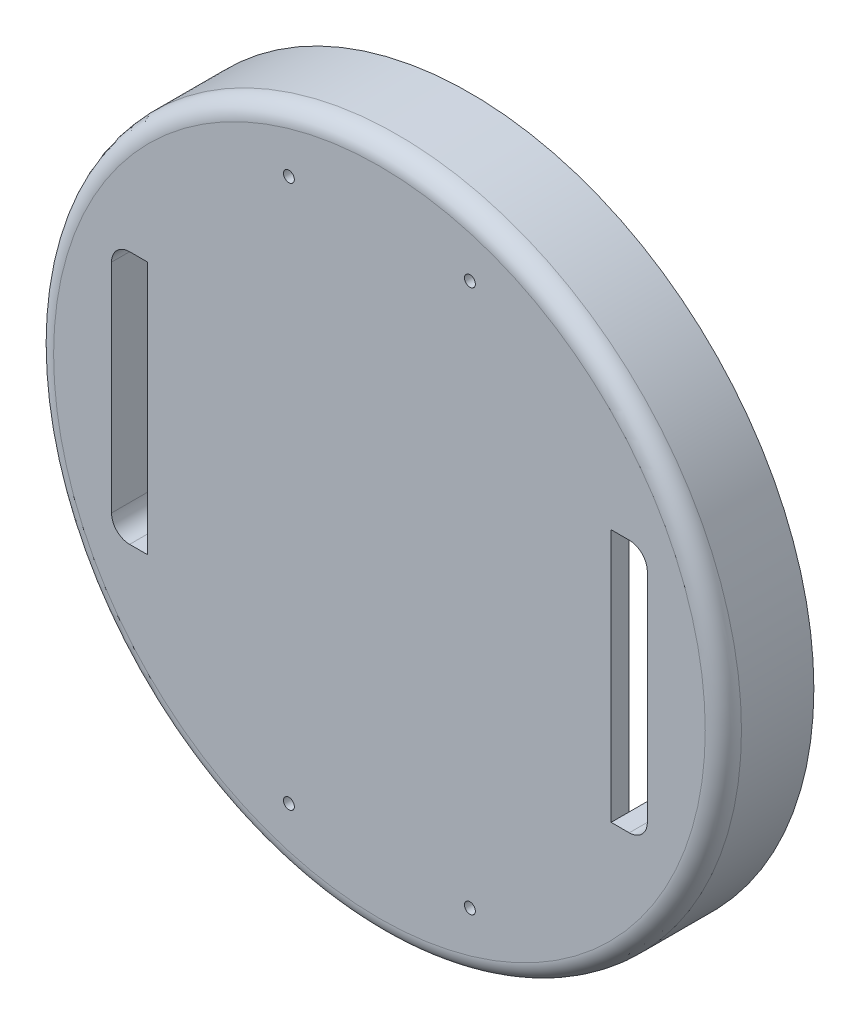
ISO-10303-21;
HEADER;
FILE_DESCRIPTION(('STEP AP214'),'2;1');
FILE_NAME('part.step','',(''),(''),'','','');
FILE_SCHEMA(('AUTOMOTIVE_DESIGN { 1 0 10303 214 1 1 1 1 }'));
ENDSEC;
DATA;
#1=APPLICATION_CONTEXT('core data for automotive mechanical design processes');
#2=APPLICATION_PROTOCOL_DEFINITION('international standard','automotive_design',2000,#1);
#3=PRODUCT_CONTEXT('',#1,'mechanical');
#4=PRODUCT('Part','Part','',(#3));
#5=PRODUCT_RELATED_PRODUCT_CATEGORY('part','',(#4));
#6=PRODUCT_DEFINITION_FORMATION('','',#4);
#7=PRODUCT_DEFINITION_CONTEXT('part definition',#1,'design');
#8=PRODUCT_DEFINITION('design','',#6,#7);
#9=PRODUCT_DEFINITION_SHAPE('','',#8);
#10=(LENGTH_UNIT() NAMED_UNIT(*) SI_UNIT(.MILLI.,.METRE.));
#11=(NAMED_UNIT(*) PLANE_ANGLE_UNIT() SI_UNIT($,.RADIAN.));
#12=(NAMED_UNIT(*) SI_UNIT($,.STERADIAN.) SOLID_ANGLE_UNIT());
#13=UNCERTAINTY_MEASURE_WITH_UNIT(LENGTH_MEASURE(1.E-05),#10,'distance_accuracy_value','');
#14=(GEOMETRIC_REPRESENTATION_CONTEXT(3) GLOBAL_UNCERTAINTY_ASSIGNED_CONTEXT((#13)) GLOBAL_UNIT_ASSIGNED_CONTEXT((#10,
#11,#12)) REPRESENTATION_CONTEXT('',''));
#15=CARTESIAN_POINT('',(0.,0.,0.));
#16=DIRECTION('',(0.,0.,1.));
#17=DIRECTION('',(1.,0.,0.));
#18=AXIS2_PLACEMENT_3D('',#15,#16,#17);
#19=CARTESIAN_POINT('',(-64.,34.2103337713535,20.));
#20=DIRECTION('',(1.,0.,0.));
#21=DIRECTION('',(0.,1.,0.));
#22=AXIS2_PLACEMENT_3D('',#19,#20,#21);
#23=PLANE('',#22);
#24=DIRECTION('',(0.,0.,-1.));
#25=VECTOR('',#24,1.);
#26=CARTESIAN_POINT('',(-64.,35.,25.));
#27=LINE('',#26,#25);
#28=CARTESIAN_POINT('',(-64.,35.,20.));
#29=VERTEX_POINT('',#28);
#30=CARTESIAN_POINT('',(-64.,35.,0.));
#31=VERTEX_POINT('',#30);
#32=EDGE_CURVE('E481',#29,#31,#27,.T.);
#33=ORIENTED_EDGE('',*,*,#32,.T.);
#34=DIRECTION('',(0.,-1.,0.));
#35=VECTOR('',#34,1.);
#36=CARTESIAN_POINT('',(-64.,34.2103337713535,0.));
#37=LINE('',#36,#35);
#38=CARTESIAN_POINT('',(-64.,64.,0.));
#39=VERTEX_POINT('',#38);
#40=EDGE_CURVE('E184',#39,#31,#37,.T.);
#41=ORIENTED_EDGE('',*,*,#40,.F.);
#42=DIRECTION('',(0.,0.,-1.));
#43=VECTOR('',#42,1.);
#44=CARTESIAN_POINT('',(-64.,64.,20.));
#45=LINE('',#44,#43);
#46=CARTESIAN_POINT('',(-64.,64.,20.));
#47=VERTEX_POINT('',#46);
#48=EDGE_CURVE('E193',#47,#39,#45,.T.);
#49=ORIENTED_EDGE('',*,*,#48,.F.);
#50=DIRECTION('',(0.,-1.,0.));
#51=VECTOR('',#50,1.);
#52=CARTESIAN_POINT('',(-64.,-34.2103337713535,20.));
#53=LINE('',#52,#51);
#54=EDGE_CURVE('E456',#47,#29,#53,.T.);
#55=ORIENTED_EDGE('',*,*,#54,.T.);
#56=EDGE_LOOP('',(#33,#41,#49,#55));
#57=FACE_BOUND('',#56,.T.);
#58=ADVANCED_FACE('F32',(#57),#23,.T.);
#59=CARTESIAN_POINT('',(64.,64.,20.));
#60=DIRECTION('',(-1.,0.,0.));
#61=DIRECTION('',(0.,-1.,0.));
#62=AXIS2_PLACEMENT_3D('',#59,#60,#61);
#63=PLANE('',#62);
#64=DIRECTION('',(0.,0.,-1.));
#65=VECTOR('',#64,1.);
#66=CARTESIAN_POINT('',(64.,35.,25.));
#67=LINE('',#66,#65);
#68=CARTESIAN_POINT('',(64.,35.,20.));
#69=VERTEX_POINT('',#68);
#70=CARTESIAN_POINT('',(64.,35.,0.));
#71=VERTEX_POINT('',#70);
#72=EDGE_CURVE('E554',#69,#71,#67,.T.);
#73=ORIENTED_EDGE('',*,*,#72,.F.);
#74=DIRECTION('',(0.,1.,0.));
#75=VECTOR('',#74,1.);
#76=CARTESIAN_POINT('',(64.,-34.2103337713414,20.));
#77=LINE('',#76,#75);
#78=CARTESIAN_POINT('',(64.,64.,20.));
#79=VERTEX_POINT('',#78);
#80=EDGE_CURVE('E462',#69,#79,#77,.T.);
#81=ORIENTED_EDGE('',*,*,#80,.T.);
#82=DIRECTION('',(0.,0.,-1.));
#83=VECTOR('',#82,1.);
#84=CARTESIAN_POINT('',(64.,64.,20.));
#85=LINE('',#84,#83);
#86=CARTESIAN_POINT('',(64.,64.,0.));
#87=VERTEX_POINT('',#86);
#88=EDGE_CURVE('E196',#79,#87,#85,.T.);
#89=ORIENTED_EDGE('',*,*,#88,.T.);
#90=DIRECTION('',(0.,1.,0.));
#91=VECTOR('',#90,1.);
#92=CARTESIAN_POINT('',(64.,64.,0.));
#93=LINE('',#92,#91);
#94=EDGE_CURVE('E468',#71,#87,#93,.T.);
#95=ORIENTED_EDGE('',*,*,#94,.F.);
#96=EDGE_LOOP('',(#73,#81,#89,#95));
#97=FACE_BOUND('',#96,.T.);
#98=ADVANCED_FACE('F226',(#97),#63,.T.);
#99=CARTESIAN_POINT('',(0.,0.,0.));
#100=DIRECTION('',(0.,0.,1.));
#101=DIRECTION('',(1.,0.,0.));
#102=AXIS2_PLACEMENT_3D('',#99,#100,#101);
#103=PLANE('',#102);
#104=CARTESIAN_POINT('',(24.9999999999984,-74.9999999999935,0.));
#105=DIRECTION('',(0.,0.,-1.));
#106=DIRECTION('',(-1.,0.,0.));
#107=AXIS2_PLACEMENT_3D('',#104,#105,#106);
#108=CIRCLE('',#107,1.50000000000383);
#109=CARTESIAN_POINT('',(23.4999999999946,-74.9999999999935,0.));
#110=VERTEX_POINT('',#109);
#111=EDGE_CURVE('E567',#110,#110,#108,.T.);
#112=ORIENTED_EDGE('',*,*,#111,.F.);
#113=EDGE_LOOP('',(#112));
#114=FACE_BOUND('',#113,.T.);
#115=CARTESIAN_POINT('',(-24.9999999999995,-75.0000000000002,0.));
#116=DIRECTION('',(0.,0.,-1.));
#117=DIRECTION('',(-1.,0.,0.));
#118=AXIS2_PLACEMENT_3D('',#115,#116,#117);
#119=CIRCLE('',#118,1.5);
#120=CARTESIAN_POINT('',(-26.4999999999995,-75.0000000000002,0.));
#121=VERTEX_POINT('',#120);
#122=EDGE_CURVE('E446',#121,#121,#119,.T.);
#123=ORIENTED_EDGE('',*,*,#122,.F.);
#124=EDGE_LOOP('',(#123));
#125=FACE_BOUND('',#124,.T.);
#126=CARTESIAN_POINT('',(-25.,75.,0.));
#127=DIRECTION('',(0.,0.,-1.));
#128=DIRECTION('',(-1.,0.,0.));
#129=AXIS2_PLACEMENT_3D('',#126,#127,#128);
#130=CIRCLE('',#129,1.5);
#131=CARTESIAN_POINT('',(-26.5,75.,0.));
#132=VERTEX_POINT('',#131);
#133=EDGE_CURVE('E439',#132,#132,#130,.T.);
#134=ORIENTED_EDGE('',*,*,#133,.F.);
#135=EDGE_LOOP('',(#134));
#136=FACE_BOUND('',#135,.T.);
#137=CARTESIAN_POINT('',(25.,75.,0.));
#138=DIRECTION('',(0.,0.,-1.));
#139=DIRECTION('',(-1.,0.,0.));
#140=AXIS2_PLACEMENT_3D('',#137,#138,#139);
#141=CIRCLE('',#140,1.5);
#142=CARTESIAN_POINT('',(23.5,75.,0.));
#143=VERTEX_POINT('',#142);
#144=EDGE_CURVE('E443',#143,#143,#141,.T.);
#145=ORIENTED_EDGE('',*,*,#144,.F.);
#146=EDGE_LOOP('',(#145));
#147=FACE_BOUND('',#146,.T.);
#148=CARTESIAN_POINT('',(0.,0.,0.));
#149=DIRECTION('',(0.,0.,1.));
#150=DIRECTION('',(1.,0.,0.));
#151=AXIS2_PLACEMENT_3D('',#148,#149,#150);
#152=CIRCLE('',#151,95.);
#153=CARTESIAN_POINT('',(95.,0.,0.));
#154=VERTEX_POINT('',#153);
#155=EDGE_CURVE('E204',#154,#154,#152,.T.);
#156=ORIENTED_EDGE('',*,*,#155,.F.);
#157=EDGE_LOOP('',(#156));
#158=FACE_BOUND('',#157,.T.);
#159=ORIENTED_EDGE('',*,*,#40,.T.);
#160=DIRECTION('',(1.,0.,0.));
#161=VECTOR('',#160,1.);
#162=CARTESIAN_POINT('',(-64.,35.,0.));
#163=LINE('',#162,#161);
#164=CARTESIAN_POINT('',(-69.,35.,0.));
#165=VERTEX_POINT('',#164);
#166=EDGE_CURVE('E484',#165,#31,#163,.T.);
#167=ORIENTED_EDGE('',*,*,#166,.F.);
#168=CARTESIAN_POINT('',(-69.,30.,0.));
#169=DIRECTION('',(0.,0.,-1.));
#170=DIRECTION('',(1.,0.,0.));
#171=AXIS2_PLACEMENT_3D('',#168,#169,#170);
#172=CIRCLE('',#171,4.99999999999999);
#173=CARTESIAN_POINT('',(-74.,30.,0.));
#174=VERTEX_POINT('',#173);
#175=EDGE_CURVE('E486',#174,#165,#172,.T.);
#176=ORIENTED_EDGE('',*,*,#175,.F.);
#177=DIRECTION('',(0.,1.,0.));
#178=VECTOR('',#177,1.);
#179=CARTESIAN_POINT('',(-74.,30.,0.));
#180=LINE('',#179,#178);
#181=CARTESIAN_POINT('',(-74.,-30.,0.));
#182=VERTEX_POINT('',#181);
#183=EDGE_CURVE('E492',#182,#174,#180,.T.);
#184=ORIENTED_EDGE('',*,*,#183,.F.);
#185=CARTESIAN_POINT('',(-69.,-30.,0.));
#186=DIRECTION('',(0.,0.,-1.));
#187=DIRECTION('',(-1.,0.,0.));
#188=AXIS2_PLACEMENT_3D('',#185,#186,#187);
#189=CIRCLE('',#188,4.99999999999998);
#190=CARTESIAN_POINT('',(-69.,-35.,0.));
#191=VERTEX_POINT('',#190);
#192=EDGE_CURVE('E178',#191,#182,#189,.T.);
#193=ORIENTED_EDGE('',*,*,#192,.F.);
#194=DIRECTION('',(-1.,0.,0.));
#195=VECTOR('',#194,1.);
#196=CARTESIAN_POINT('',(-64.,-35.,0.));
#197=LINE('',#196,#195);
#198=CARTESIAN_POINT('',(-64.,-35.,0.));
#199=VERTEX_POINT('',#198);
#200=EDGE_CURVE('E161',#199,#191,#197,.T.);
#201=ORIENTED_EDGE('',*,*,#200,.F.);
#202=CARTESIAN_POINT('',(-64.,-64.,0.));
#203=VERTEX_POINT('',#202);
#204=EDGE_CURVE('E174',#199,#203,#37,.T.);
#205=ORIENTED_EDGE('',*,*,#204,.T.);
#206=DIRECTION('',(1.,0.,0.));
#207=VECTOR('',#206,1.);
#208=CARTESIAN_POINT('',(64.,-64.,0.));
#209=LINE('',#208,#207);
#210=CARTESIAN_POINT('',(64.,-64.,0.));
#211=VERTEX_POINT('',#210);
#212=EDGE_CURVE('E453',#203,#211,#209,.T.);
#213=ORIENTED_EDGE('',*,*,#212,.T.);
#214=CARTESIAN_POINT('',(64.,-35.,0.));
#215=VERTEX_POINT('',#214);
#216=EDGE_CURVE('E189',#211,#215,#93,.T.);
#217=ORIENTED_EDGE('',*,*,#216,.T.);
#218=DIRECTION('',(-1.,0.,0.));
#219=VECTOR('',#218,1.);
#220=CARTESIAN_POINT('',(64.,-35.,0.));
#221=LINE('',#220,#219);
#222=CARTESIAN_POINT('',(69.,-35.,0.));
#223=VERTEX_POINT('',#222);
#224=EDGE_CURVE('E529',#223,#215,#221,.T.);
#225=ORIENTED_EDGE('',*,*,#224,.F.);
#226=CARTESIAN_POINT('',(69.,-30.,0.));
#227=DIRECTION('',(0.,0.,-1.));
#228=DIRECTION('',(1.,0.,0.));
#229=AXIS2_PLACEMENT_3D('',#226,#227,#228);
#230=CIRCLE('',#229,4.99999999999998);
#231=CARTESIAN_POINT('',(74.,-30.,0.));
#232=VERTEX_POINT('',#231);
#233=EDGE_CURVE('E526',#232,#223,#230,.T.);
#234=ORIENTED_EDGE('',*,*,#233,.F.);
#235=DIRECTION('',(0.,-1.,0.));
#236=VECTOR('',#235,1.);
#237=CARTESIAN_POINT('',(74.,30.,0.));
#238=LINE('',#237,#236);
#239=CARTESIAN_POINT('',(74.,30.,0.));
#240=VERTEX_POINT('',#239);
#241=EDGE_CURVE('E523',#240,#232,#238,.T.);
#242=ORIENTED_EDGE('',*,*,#241,.F.);
#243=CARTESIAN_POINT('',(69.,30.,0.));
#244=DIRECTION('',(0.,0.,-1.));
#245=DIRECTION('',(-1.,0.,0.));
#246=AXIS2_PLACEMENT_3D('',#243,#244,#245);
#247=CIRCLE('',#246,4.99999999999999);
#248=CARTESIAN_POINT('',(69.,35.,0.));
#249=VERTEX_POINT('',#248);
#250=EDGE_CURVE('E520',#249,#240,#247,.T.);
#251=ORIENTED_EDGE('',*,*,#250,.F.);
#252=DIRECTION('',(1.,0.,0.));
#253=VECTOR('',#252,1.);
#254=CARTESIAN_POINT('',(64.,35.,0.));
#255=LINE('',#254,#253);
#256=EDGE_CURVE('E475',#71,#249,#255,.T.);
#257=ORIENTED_EDGE('',*,*,#256,.F.);
#258=ORIENTED_EDGE('',*,*,#94,.T.);
#259=DIRECTION('',(-1.,0.,0.));
#260=VECTOR('',#259,1.);
#261=CARTESIAN_POINT('',(64.,64.,0.));
#262=LINE('',#261,#260);
#263=EDGE_CURVE('E185',#87,#39,#262,.T.);
#264=ORIENTED_EDGE('',*,*,#263,.T.);
#265=EDGE_LOOP('',(#159,#167,#176,#184,#193,#201,#205,#213,#217,#225,#234,#242,#251,#257,#258,#264));
#266=FACE_BOUND('',#265,.T.);
#267=ADVANCED_FACE('F172',(#114,#125,#136,#147,#158,#266),#103,.F.);
#268=CARTESIAN_POINT('',(0.,0.,20.));
#269=DIRECTION('',(0.,0.,-1.));
#270=DIRECTION('',(-1.,0.,0.));
#271=AXIS2_PLACEMENT_3D('',#268,#269,#270);
#272=CYLINDRICAL_SURFACE('',#271,95.);
#273=CARTESIAN_POINT('',(0.,0.,20.));
#274=DIRECTION('',(0.,0.,1.));
#275=DIRECTION('',(1.,0.,0.));
#276=AXIS2_PLACEMENT_3D('',#273,#274,#275);
#277=CIRCLE('',#276,95.);
#278=CARTESIAN_POINT('',(95.,0.,20.));
#279=VERTEX_POINT('',#278);
#280=EDGE_CURVE('E11',#279,#279,#277,.F.);
#281=ORIENTED_EDGE('',*,*,#280,.T.);
#282=EDGE_LOOP('',(#281));
#283=FACE_BOUND('',#282,.T.);
#284=ORIENTED_EDGE('',*,*,#155,.T.);
#285=EDGE_LOOP('',(#284));
#286=FACE_BOUND('',#285,.T.);
#287=ADVANCED_FACE('F255',(#283,#286),#272,.T.);
#288=CARTESIAN_POINT('',(64.,-64.,20.));
#289=DIRECTION('',(0.,1.,0.));
#290=DIRECTION('',(-1.,0.,0.));
#291=AXIS2_PLACEMENT_3D('',#288,#289,#290);
#292=PLANE('',#291);
#293=ORIENTED_EDGE('',*,*,#212,.F.);
#294=DIRECTION('',(0.,0.,-1.));
#295=VECTOR('',#294,1.);
#296=CARTESIAN_POINT('',(-64.,-64.,20.));
#297=LINE('',#296,#295);
#298=CARTESIAN_POINT('',(-64.,-64.,20.));
#299=VERTEX_POINT('',#298);
#300=EDGE_CURVE('E182',#299,#203,#297,.T.);
#301=ORIENTED_EDGE('',*,*,#300,.F.);
#302=DIRECTION('',(1.,0.,0.));
#303=VECTOR('',#302,1.);
#304=CARTESIAN_POINT('',(64.,-64.,20.));
#305=LINE('',#304,#303);
#306=CARTESIAN_POINT('',(64.,-64.,20.));
#307=VERTEX_POINT('',#306);
#308=EDGE_CURVE('E459',#299,#307,#305,.T.);
#309=ORIENTED_EDGE('',*,*,#308,.T.);
#310=DIRECTION('',(0.,0.,-1.));
#311=VECTOR('',#310,1.);
#312=CARTESIAN_POINT('',(64.,-64.,20.));
#313=LINE('',#312,#311);
#314=EDGE_CURVE('E200',#307,#211,#313,.T.);
#315=ORIENTED_EDGE('',*,*,#314,.T.);
#316=EDGE_LOOP('',(#293,#301,#309,#315));
#317=FACE_BOUND('',#316,.T.);
#318=ADVANCED_FACE('F249',(#317),#292,.T.);
#319=DIRECTION('',(0.,0.,-1.));
#320=VECTOR('',#319,1.);
#321=CARTESIAN_POINT('',(64.,-35.,25.));
#322=LINE('',#321,#320);
#323=CARTESIAN_POINT('',(64.,-35.,20.));
#324=VERTEX_POINT('',#323);
#325=EDGE_CURVE('E557',#324,#215,#322,.T.);
#326=ORIENTED_EDGE('',*,*,#325,.T.);
#327=ORIENTED_EDGE('',*,*,#216,.F.);
#328=ORIENTED_EDGE('',*,*,#314,.F.);
#329=EDGE_CURVE('E463',#307,#324,#77,.T.);
#330=ORIENTED_EDGE('',*,*,#329,.T.);
#331=EDGE_LOOP('',(#326,#327,#328,#330));
#332=FACE_BOUND('',#331,.T.);
#333=ADVANCED_FACE('F234',(#332),#63,.T.);
#334=CARTESIAN_POINT('',(64.,64.,20.));
#335=DIRECTION('',(0.,-1.,0.));
#336=DIRECTION('',(1.,0.,0.));
#337=AXIS2_PLACEMENT_3D('',#334,#335,#336);
#338=PLANE('',#337);
#339=ORIENTED_EDGE('',*,*,#263,.F.);
#340=ORIENTED_EDGE('',*,*,#88,.F.);
#341=DIRECTION('',(-1.,0.,0.));
#342=VECTOR('',#341,1.);
#343=CARTESIAN_POINT('',(64.,64.,20.));
#344=LINE('',#343,#342);
#345=EDGE_CURVE('E197',#79,#47,#344,.T.);
#346=ORIENTED_EDGE('',*,*,#345,.T.);
#347=ORIENTED_EDGE('',*,*,#48,.T.);
#348=EDGE_LOOP('',(#339,#340,#346,#347));
#349=FACE_BOUND('',#348,.T.);
#350=ADVANCED_FACE('F239',(#349),#338,.T.);
#351=DIRECTION('',(0.,0.,-1.));
#352=VECTOR('',#351,1.);
#353=CARTESIAN_POINT('',(-64.,-35.,25.));
#354=LINE('',#353,#352);
#355=CARTESIAN_POINT('',(-64.,-35.,20.));
#356=VERTEX_POINT('',#355);
#357=EDGE_CURVE('E158',#356,#199,#354,.T.);
#358=ORIENTED_EDGE('',*,*,#357,.F.);
#359=EDGE_CURVE('E187',#356,#299,#53,.T.);
#360=ORIENTED_EDGE('',*,*,#359,.T.);
#361=ORIENTED_EDGE('',*,*,#300,.T.);
#362=ORIENTED_EDGE('',*,*,#204,.F.);
#363=EDGE_LOOP('',(#358,#360,#361,#362));
#364=FACE_BOUND('',#363,.T.);
#365=ADVANCED_FACE('F180',(#364),#23,.T.);
#366=CARTESIAN_POINT('',(0.,0.,20.));
#367=DIRECTION('',(0.,0.,1.));
#368=DIRECTION('',(1.,0.,0.));
#369=AXIS2_PLACEMENT_3D('',#366,#367,#368);
#370=PLANE('',#369);
#371=ORIENTED_EDGE('',*,*,#308,.F.);
#372=ORIENTED_EDGE('',*,*,#359,.F.);
#373=DIRECTION('',(0.,1.,0.));
#374=VECTOR('',#373,1.);
#375=CARTESIAN_POINT('',(-64.,0.,20.));
#376=LINE('',#375,#374);
#377=EDGE_CURVE('E508',#356,#29,#376,.T.);
#378=ORIENTED_EDGE('',*,*,#377,.T.);
#379=ORIENTED_EDGE('',*,*,#54,.F.);
#380=ORIENTED_EDGE('',*,*,#345,.F.);
#381=ORIENTED_EDGE('',*,*,#80,.F.);
#382=DIRECTION('',(0.,-1.,0.));
#383=VECTOR('',#382,1.);
#384=CARTESIAN_POINT('',(64.,0.,20.));
#385=LINE('',#384,#383);
#386=EDGE_CURVE('E553',#69,#324,#385,.T.);
#387=ORIENTED_EDGE('',*,*,#386,.T.);
#388=ORIENTED_EDGE('',*,*,#329,.F.);
#389=EDGE_LOOP('',(#371,#372,#378,#379,#380,#381,#387,#388));
#390=FACE_BOUND('',#389,.T.);
#391=ADVANCED_FACE('F221',(#390),#370,.F.);
#392=CARTESIAN_POINT('',(0.,0.,25.));
#393=DIRECTION('',(0.,0.,1.));
#394=DIRECTION('',(1.,0.,0.));
#395=AXIS2_PLACEMENT_3D('',#392,#393,#394);
#396=PLANE('',#395);
#397=DIRECTION('',(0.,-1.,0.));
#398=VECTOR('',#397,1.);
#399=CARTESIAN_POINT('',(-64.,35.,25.));
#400=LINE('',#399,#398);
#401=CARTESIAN_POINT('',(-64.,35.,25.));
#402=VERTEX_POINT('',#401);
#403=CARTESIAN_POINT('',(-64.,-35.,25.));
#404=VERTEX_POINT('',#403);
#405=EDGE_CURVE('E487',#402,#404,#400,.T.);
#406=ORIENTED_EDGE('',*,*,#405,.T.);
#407=DIRECTION('',(-1.,0.,0.));
#408=VECTOR('',#407,1.);
#409=CARTESIAN_POINT('',(-64.,-35.,25.));
#410=LINE('',#409,#408);
#411=CARTESIAN_POINT('',(-69.,-35.,25.));
#412=VERTEX_POINT('',#411);
#413=EDGE_CURVE('E490',#404,#412,#410,.T.);
#414=ORIENTED_EDGE('',*,*,#413,.T.);
#415=CARTESIAN_POINT('',(-69.,-30.,25.));
#416=DIRECTION('',(0.,0.,-1.));
#417=DIRECTION('',(-1.,0.,0.));
#418=AXIS2_PLACEMENT_3D('',#415,#416,#417);
#419=CIRCLE('',#418,4.99999999999998);
#420=CARTESIAN_POINT('',(-74.,-30.,25.));
#421=VERTEX_POINT('',#420);
#422=EDGE_CURVE('E55',#412,#421,#419,.T.);
#423=ORIENTED_EDGE('',*,*,#422,.T.);
#424=DIRECTION('',(0.,1.,0.));
#425=VECTOR('',#424,1.);
#426=CARTESIAN_POINT('',(-74.,30.,25.));
#427=LINE('',#426,#425);
#428=CARTESIAN_POINT('',(-74.,30.,25.));
#429=VERTEX_POINT('',#428);
#430=EDGE_CURVE('E499',#421,#429,#427,.T.);
#431=ORIENTED_EDGE('',*,*,#430,.T.);
#432=CARTESIAN_POINT('',(-69.,30.,25.));
#433=DIRECTION('',(0.,0.,-1.));
#434=DIRECTION('',(1.,0.,0.));
#435=AXIS2_PLACEMENT_3D('',#432,#433,#434);
#436=CIRCLE('',#435,4.99999999999999);
#437=CARTESIAN_POINT('',(-69.,35.,25.));
#438=VERTEX_POINT('',#437);
#439=EDGE_CURVE('E502',#429,#438,#436,.T.);
#440=ORIENTED_EDGE('',*,*,#439,.T.);
#441=DIRECTION('',(1.,0.,0.));
#442=VECTOR('',#441,1.);
#443=CARTESIAN_POINT('',(-64.,35.,25.));
#444=LINE('',#443,#442);
#445=EDGE_CURVE('E168',#438,#402,#444,.T.);
#446=ORIENTED_EDGE('',*,*,#445,.T.);
#447=EDGE_LOOP('',(#406,#414,#423,#431,#440,#446));
#448=FACE_BOUND('',#447,.T.);
#449=DIRECTION('',(1.,0.,0.));
#450=VECTOR('',#449,1.);
#451=CARTESIAN_POINT('',(64.,35.,25.));
#452=LINE('',#451,#450);
#453=CARTESIAN_POINT('',(64.,35.,25.));
#454=VERTEX_POINT('',#453);
#455=CARTESIAN_POINT('',(69.,35.,25.));
#456=VERTEX_POINT('',#455);
#457=EDGE_CURVE('E531',#454,#456,#452,.T.);
#458=ORIENTED_EDGE('',*,*,#457,.T.);
#459=CARTESIAN_POINT('',(69.,30.,25.));
#460=DIRECTION('',(0.,0.,-1.));
#461=DIRECTION('',(-1.,0.,0.));
#462=AXIS2_PLACEMENT_3D('',#459,#460,#461);
#463=CIRCLE('',#462,4.99999999999999);
#464=CARTESIAN_POINT('',(74.,30.,25.));
#465=VERTEX_POINT('',#464);
#466=EDGE_CURVE('E534',#456,#465,#463,.T.);
#467=ORIENTED_EDGE('',*,*,#466,.T.);
#468=DIRECTION('',(0.,-1.,0.));
#469=VECTOR('',#468,1.);
#470=CARTESIAN_POINT('',(74.,30.,25.));
#471=LINE('',#470,#469);
#472=CARTESIAN_POINT('',(74.,-30.,25.));
#473=VERTEX_POINT('',#472);
#474=EDGE_CURVE('E537',#465,#473,#471,.T.);
#475=ORIENTED_EDGE('',*,*,#474,.T.);
#476=CARTESIAN_POINT('',(69.,-30.,25.));
#477=DIRECTION('',(0.,0.,-1.));
#478=DIRECTION('',(1.,0.,0.));
#479=AXIS2_PLACEMENT_3D('',#476,#477,#478);
#480=CIRCLE('',#479,4.99999999999998);
#481=CARTESIAN_POINT('',(69.,-35.,25.));
#482=VERTEX_POINT('',#481);
#483=EDGE_CURVE('E540',#473,#482,#480,.T.);
#484=ORIENTED_EDGE('',*,*,#483,.T.);
#485=DIRECTION('',(-1.,0.,0.));
#486=VECTOR('',#485,1.);
#487=CARTESIAN_POINT('',(64.,-35.,25.));
#488=LINE('',#487,#486);
#489=CARTESIAN_POINT('',(64.,-35.,25.));
#490=VERTEX_POINT('',#489);
#491=EDGE_CURVE('E543',#482,#490,#488,.T.);
#492=ORIENTED_EDGE('',*,*,#491,.T.);
#493=DIRECTION('',(0.,1.,0.));
#494=VECTOR('',#493,1.);
#495=CARTESIAN_POINT('',(64.,35.,25.));
#496=LINE('',#495,#494);
#497=EDGE_CURVE('E546',#490,#454,#496,.T.);
#498=ORIENTED_EDGE('',*,*,#497,.T.);
#499=EDGE_LOOP('',(#458,#467,#475,#484,#492,#498));
#500=FACE_BOUND('',#499,.T.);
#501=CARTESIAN_POINT('',(24.9999999999984,-74.9999999999935,25.));
#502=DIRECTION('',(0.,0.,-1.));
#503=DIRECTION('',(-1.,0.,0.));
#504=AXIS2_PLACEMENT_3D('',#501,#502,#503);
#505=CIRCLE('',#504,1.50000000000383);
#506=CARTESIAN_POINT('',(23.4999999999946,-74.9999999999935,25.));
#507=VERTEX_POINT('',#506);
#508=EDGE_CURVE('E568',#507,#507,#505,.T.);
#509=ORIENTED_EDGE('',*,*,#508,.T.);
#510=EDGE_LOOP('',(#509));
#511=FACE_BOUND('',#510,.T.);
#512=CARTESIAN_POINT('',(-24.9999999999995,-75.0000000000002,25.));
#513=DIRECTION('',(0.,0.,-1.));
#514=DIRECTION('',(-1.,0.,0.));
#515=AXIS2_PLACEMENT_3D('',#512,#513,#514);
#516=CIRCLE('',#515,1.5);
#517=CARTESIAN_POINT('',(-26.4999999999995,-75.0000000000002,25.));
#518=VERTEX_POINT('',#517);
#519=EDGE_CURVE('E441',#518,#518,#516,.T.);
#520=ORIENTED_EDGE('',*,*,#519,.T.);
#521=EDGE_LOOP('',(#520));
#522=FACE_BOUND('',#521,.T.);
#523=CARTESIAN_POINT('',(-25.,75.,25.));
#524=DIRECTION('',(0.,0.,-1.));
#525=DIRECTION('',(-1.,0.,0.));
#526=AXIS2_PLACEMENT_3D('',#523,#524,#525);
#527=CIRCLE('',#526,1.5);
#528=CARTESIAN_POINT('',(-26.5,75.,25.));
#529=VERTEX_POINT('',#528);
#530=EDGE_CURVE('E436',#529,#529,#527,.T.);
#531=ORIENTED_EDGE('',*,*,#530,.T.);
#532=EDGE_LOOP('',(#531));
#533=FACE_BOUND('',#532,.T.);
#534=CARTESIAN_POINT('',(25.,75.,25.));
#535=DIRECTION('',(0.,0.,-1.));
#536=DIRECTION('',(-1.,0.,0.));
#537=AXIS2_PLACEMENT_3D('',#534,#535,#536);
#538=CIRCLE('',#537,1.5);
#539=CARTESIAN_POINT('',(23.5,75.,25.));
#540=VERTEX_POINT('',#539);
#541=EDGE_CURVE('E450',#540,#540,#538,.T.);
#542=ORIENTED_EDGE('',*,*,#541,.T.);
#543=EDGE_LOOP('',(#542));
#544=FACE_BOUND('',#543,.T.);
#545=CARTESIAN_POINT('',(0.,0.,25.));
#546=DIRECTION('',(0.,0.,1.));
#547=DIRECTION('',(1.,0.,0.));
#548=AXIS2_PLACEMENT_3D('',#545,#546,#547);
#549=CIRCLE('',#548,90.);
#550=CARTESIAN_POINT('',(90.,0.,25.));
#551=VERTEX_POINT('',#550);
#552=EDGE_CURVE('E40',#551,#551,#549,.T.);
#553=ORIENTED_EDGE('',*,*,#552,.T.);
#554=EDGE_LOOP('',(#553));
#555=FACE_BOUND('',#554,.T.);
#556=ADVANCED_FACE('F209',(#448,#500,#511,#522,#533,#544,#555),#396,.T.);
#557=CARTESIAN_POINT('',(0.,0.,20.));
#558=DIRECTION('',(0.,0.,1.));
#559=DIRECTION('',(1.,0.,0.));
#560=AXIS2_PLACEMENT_3D('',#557,#558,#559);
#561=TOROIDAL_SURFACE('',#560,90.,5.);
#562=ORIENTED_EDGE('',*,*,#280,.F.);
#563=EDGE_LOOP('',(#562));
#564=FACE_BOUND('',#563,.T.);
#565=ORIENTED_EDGE('',*,*,#552,.F.);
#566=EDGE_LOOP('',(#565));
#567=FACE_BOUND('',#566,.T.);
#568=ADVANCED_FACE('F34',(#564,#567),#561,.T.);
#569=CARTESIAN_POINT('',(25.,75.,25.));
#570=DIRECTION('',(0.,0.,-1.));
#571=DIRECTION('',(-1.,0.,0.));
#572=AXIS2_PLACEMENT_3D('',#569,#570,#571);
#573=CYLINDRICAL_SURFACE('',#572,1.5);
#574=ORIENTED_EDGE('',*,*,#541,.F.);
#575=EDGE_LOOP('',(#574));
#576=FACE_BOUND('',#575,.T.);
#577=ORIENTED_EDGE('',*,*,#144,.T.);
#578=EDGE_LOOP('',(#577));
#579=FACE_BOUND('',#578,.T.);
#580=ADVANCED_FACE('F212',(#576,#579),#573,.F.);
#581=CARTESIAN_POINT('',(-25.,75.,25.));
#582=DIRECTION('',(0.,0.,-1.));
#583=DIRECTION('',(-1.,0.,0.));
#584=AXIS2_PLACEMENT_3D('',#581,#582,#583);
#585=CYLINDRICAL_SURFACE('',#584,1.5);
#586=ORIENTED_EDGE('',*,*,#530,.F.);
#587=EDGE_LOOP('',(#586));
#588=FACE_BOUND('',#587,.T.);
#589=ORIENTED_EDGE('',*,*,#133,.T.);
#590=EDGE_LOOP('',(#589));
#591=FACE_BOUND('',#590,.T.);
#592=ADVANCED_FACE('F218',(#588,#591),#585,.F.);
#593=CARTESIAN_POINT('',(-24.9999999999995,-75.0000000000002,25.));
#594=DIRECTION('',(0.,0.,-1.));
#595=DIRECTION('',(-1.,0.,0.));
#596=AXIS2_PLACEMENT_3D('',#593,#594,#595);
#597=CYLINDRICAL_SURFACE('',#596,1.5);
#598=ORIENTED_EDGE('',*,*,#519,.F.);
#599=EDGE_LOOP('',(#598));
#600=FACE_BOUND('',#599,.T.);
#601=ORIENTED_EDGE('',*,*,#122,.T.);
#602=EDGE_LOOP('',(#601));
#603=FACE_BOUND('',#602,.T.);
#604=ADVANCED_FACE('F424',(#600,#603),#597,.F.);
#605=CARTESIAN_POINT('',(24.9999999999984,-74.9999999999935,25.));
#606=DIRECTION('',(0.,0.,-1.));
#607=DIRECTION('',(-1.,0.,0.));
#608=AXIS2_PLACEMENT_3D('',#605,#606,#607);
#609=CYLINDRICAL_SURFACE('',#608,1.50000000000383);
#610=ORIENTED_EDGE('',*,*,#508,.F.);
#611=EDGE_LOOP('',(#610));
#612=FACE_BOUND('',#611,.T.);
#613=ORIENTED_EDGE('',*,*,#111,.T.);
#614=EDGE_LOOP('',(#613));
#615=FACE_BOUND('',#614,.T.);
#616=ADVANCED_FACE('F310',(#612,#615),#609,.F.);
#617=CARTESIAN_POINT('',(64.,35.,25.));
#618=DIRECTION('',(-1.,0.,0.));
#619=DIRECTION('',(0.,-1.,0.));
#620=AXIS2_PLACEMENT_3D('',#617,#618,#619);
#621=PLANE('',#620);
#622=EDGE_CURVE('E550',#454,#69,#67,.T.);
#623=ORIENTED_EDGE('',*,*,#622,.F.);
#624=ORIENTED_EDGE('',*,*,#497,.F.);
#625=EDGE_CURVE('E555',#490,#324,#322,.T.);
#626=ORIENTED_EDGE('',*,*,#625,.T.);
#627=ORIENTED_EDGE('',*,*,#386,.F.);
#628=EDGE_LOOP('',(#623,#624,#626,#627));
#629=FACE_BOUND('',#628,.T.);
#630=ADVANCED_FACE('F304',(#629),#621,.F.);
#631=CARTESIAN_POINT('',(64.,35.,25.));
#632=DIRECTION('',(0.,1.,0.));
#633=DIRECTION('',(-1.,0.,0.));
#634=AXIS2_PLACEMENT_3D('',#631,#632,#633);
#635=PLANE('',#634);
#636=DIRECTION('',(0.,0.,-1.));
#637=VECTOR('',#636,1.);
#638=CARTESIAN_POINT('',(69.,35.,25.));
#639=LINE('',#638,#637);
#640=EDGE_CURVE('E549',#456,#249,#639,.T.);
#641=ORIENTED_EDGE('',*,*,#640,.F.);
#642=ORIENTED_EDGE('',*,*,#457,.F.);
#643=ORIENTED_EDGE('',*,*,#622,.T.);
#644=ORIENTED_EDGE('',*,*,#72,.T.);
#645=ORIENTED_EDGE('',*,*,#256,.T.);
#646=EDGE_LOOP('',(#641,#642,#643,#644,#645));
#647=FACE_BOUND('',#646,.T.);
#648=ADVANCED_FACE('F309',(#647),#635,.F.);
#649=CARTESIAN_POINT('',(64.,-35.,25.));
#650=DIRECTION('',(0.,-1.,0.));
#651=DIRECTION('',(1.,0.,0.));
#652=AXIS2_PLACEMENT_3D('',#649,#650,#651);
#653=PLANE('',#652);
#654=ORIENTED_EDGE('',*,*,#625,.F.);
#655=ORIENTED_EDGE('',*,*,#491,.F.);
#656=DIRECTION('',(0.,0.,-1.));
#657=VECTOR('',#656,1.);
#658=CARTESIAN_POINT('',(69.,-35.,25.));
#659=LINE('',#658,#657);
#660=EDGE_CURVE('E558',#482,#223,#659,.T.);
#661=ORIENTED_EDGE('',*,*,#660,.T.);
#662=ORIENTED_EDGE('',*,*,#224,.T.);
#663=ORIENTED_EDGE('',*,*,#325,.F.);
#664=EDGE_LOOP('',(#654,#655,#661,#662,#663));
#665=FACE_BOUND('',#664,.T.);
#666=ADVANCED_FACE('F322',(#665),#653,.F.);
#667=CARTESIAN_POINT('',(69.,-30.,25.));
#668=DIRECTION('',(0.,0.,-1.));
#669=DIRECTION('',(-1.,0.,0.));
#670=AXIS2_PLACEMENT_3D('',#667,#668,#669);
#671=CYLINDRICAL_SURFACE('',#670,4.99999999999998);
#672=ORIENTED_EDGE('',*,*,#660,.F.);
#673=ORIENTED_EDGE('',*,*,#483,.F.);
#674=DIRECTION('',(0.,0.,-1.));
#675=VECTOR('',#674,1.);
#676=CARTESIAN_POINT('',(74.,-30.,25.));
#677=LINE('',#676,#675);
#678=EDGE_CURVE('E560',#473,#232,#677,.T.);
#679=ORIENTED_EDGE('',*,*,#678,.T.);
#680=ORIENTED_EDGE('',*,*,#233,.T.);
#681=EDGE_LOOP('',(#672,#673,#679,#680));
#682=FACE_BOUND('',#681,.T.);
#683=ADVANCED_FACE('F332',(#682),#671,.F.);
#684=CARTESIAN_POINT('',(74.,30.,25.));
#685=DIRECTION('',(1.,0.,0.));
#686=DIRECTION('',(0.,1.,0.));
#687=AXIS2_PLACEMENT_3D('',#684,#685,#686);
#688=PLANE('',#687);
#689=ORIENTED_EDGE('',*,*,#678,.F.);
#690=ORIENTED_EDGE('',*,*,#474,.F.);
#691=DIRECTION('',(0.,0.,-1.));
#692=VECTOR('',#691,1.);
#693=CARTESIAN_POINT('',(74.,30.,25.));
#694=LINE('',#693,#692);
#695=EDGE_CURVE('E562',#465,#240,#694,.T.);
#696=ORIENTED_EDGE('',*,*,#695,.T.);
#697=ORIENTED_EDGE('',*,*,#241,.T.);
#698=EDGE_LOOP('',(#689,#690,#696,#697));
#699=FACE_BOUND('',#698,.T.);
#700=ADVANCED_FACE('F342',(#699),#688,.F.);
#701=CARTESIAN_POINT('',(69.,30.,25.));
#702=DIRECTION('',(0.,0.,-1.));
#703=DIRECTION('',(-1.,0.,0.));
#704=AXIS2_PLACEMENT_3D('',#701,#702,#703);
#705=CYLINDRICAL_SURFACE('',#704,4.99999999999999);
#706=ORIENTED_EDGE('',*,*,#695,.F.);
#707=ORIENTED_EDGE('',*,*,#466,.F.);
#708=ORIENTED_EDGE('',*,*,#640,.T.);
#709=ORIENTED_EDGE('',*,*,#250,.T.);
#710=EDGE_LOOP('',(#706,#707,#708,#709));
#711=FACE_BOUND('',#710,.T.);
#712=ADVANCED_FACE('F352',(#711),#705,.F.);
#713=CARTESIAN_POINT('',(-64.,35.,25.));
#714=DIRECTION('',(1.,0.,0.));
#715=DIRECTION('',(0.,1.,0.));
#716=AXIS2_PLACEMENT_3D('',#713,#714,#715);
#717=PLANE('',#716);
#718=EDGE_CURVE('E164',#404,#356,#354,.T.);
#719=ORIENTED_EDGE('',*,*,#718,.F.);
#720=ORIENTED_EDGE('',*,*,#405,.F.);
#721=EDGE_CURVE('E47',#402,#29,#27,.T.);
#722=ORIENTED_EDGE('',*,*,#721,.T.);
#723=ORIENTED_EDGE('',*,*,#377,.F.);
#724=EDGE_LOOP('',(#719,#720,#722,#723));
#725=FACE_BOUND('',#724,.T.);
#726=ADVANCED_FACE('F362',(#725),#717,.F.);
#727=CARTESIAN_POINT('',(-64.,35.,25.));
#728=DIRECTION('',(0.,1.,0.));
#729=DIRECTION('',(-1.,0.,0.));
#730=AXIS2_PLACEMENT_3D('',#727,#728,#729);
#731=PLANE('',#730);
#732=ORIENTED_EDGE('',*,*,#721,.F.);
#733=ORIENTED_EDGE('',*,*,#445,.F.);
#734=DIRECTION('',(0.,0.,-1.));
#735=VECTOR('',#734,1.);
#736=CARTESIAN_POINT('',(-69.,35.,25.));
#737=LINE('',#736,#735);
#738=EDGE_CURVE('E509',#438,#165,#737,.T.);
#739=ORIENTED_EDGE('',*,*,#738,.T.);
#740=ORIENTED_EDGE('',*,*,#166,.T.);
#741=ORIENTED_EDGE('',*,*,#32,.F.);
#742=EDGE_LOOP('',(#732,#733,#739,#740,#741));
#743=FACE_BOUND('',#742,.T.);
#744=ADVANCED_FACE('F372',(#743),#731,.F.);
#745=CARTESIAN_POINT('',(-69.,30.,25.));
#746=DIRECTION('',(0.,0.,-1.));
#747=DIRECTION('',(-1.,0.,0.));
#748=AXIS2_PLACEMENT_3D('',#745,#746,#747);
#749=CYLINDRICAL_SURFACE('',#748,4.99999999999999);
#750=ORIENTED_EDGE('',*,*,#738,.F.);
#751=ORIENTED_EDGE('',*,*,#439,.F.);
#752=DIRECTION('',(0.,0.,-1.));
#753=VECTOR('',#752,1.);
#754=CARTESIAN_POINT('',(-74.,30.,25.));
#755=LINE('',#754,#753);
#756=EDGE_CURVE('E511',#429,#174,#755,.T.);
#757=ORIENTED_EDGE('',*,*,#756,.T.);
#758=ORIENTED_EDGE('',*,*,#175,.T.);
#759=EDGE_LOOP('',(#750,#751,#757,#758));
#760=FACE_BOUND('',#759,.T.);
#761=ADVANCED_FACE('F381',(#760),#749,.F.);
#762=CARTESIAN_POINT('',(-74.,30.,25.));
#763=DIRECTION('',(-1.,0.,0.));
#764=DIRECTION('',(0.,-1.,0.));
#765=AXIS2_PLACEMENT_3D('',#762,#763,#764);
#766=PLANE('',#765);
#767=ORIENTED_EDGE('',*,*,#756,.F.);
#768=ORIENTED_EDGE('',*,*,#430,.F.);
#769=DIRECTION('',(0.,0.,-1.));
#770=VECTOR('',#769,1.);
#771=CARTESIAN_POINT('',(-74.,-30.,25.));
#772=LINE('',#771,#770);
#773=EDGE_CURVE('E513',#421,#182,#772,.T.);
#774=ORIENTED_EDGE('',*,*,#773,.T.);
#775=ORIENTED_EDGE('',*,*,#183,.T.);
#776=EDGE_LOOP('',(#767,#768,#774,#775));
#777=FACE_BOUND('',#776,.T.);
#778=ADVANCED_FACE('F391',(#777),#766,.F.);
#779=CARTESIAN_POINT('',(-69.,-30.,25.));
#780=DIRECTION('',(0.,0.,-1.));
#781=DIRECTION('',(-1.,0.,0.));
#782=AXIS2_PLACEMENT_3D('',#779,#780,#781);
#783=CYLINDRICAL_SURFACE('',#782,4.99999999999998);
#784=ORIENTED_EDGE('',*,*,#773,.F.);
#785=ORIENTED_EDGE('',*,*,#422,.F.);
#786=DIRECTION('',(0.,0.,-1.));
#787=VECTOR('',#786,1.);
#788=CARTESIAN_POINT('',(-69.,-35.,25.));
#789=LINE('',#788,#787);
#790=EDGE_CURVE('E515',#412,#191,#789,.T.);
#791=ORIENTED_EDGE('',*,*,#790,.T.);
#792=ORIENTED_EDGE('',*,*,#192,.T.);
#793=EDGE_LOOP('',(#784,#785,#791,#792));
#794=FACE_BOUND('',#793,.T.);
#795=ADVANCED_FACE('F401',(#794),#783,.F.);
#796=CARTESIAN_POINT('',(-64.,-35.,25.));
#797=DIRECTION('',(0.,-1.,0.));
#798=DIRECTION('',(1.,0.,0.));
#799=AXIS2_PLACEMENT_3D('',#796,#797,#798);
#800=PLANE('',#799);
#801=ORIENTED_EDGE('',*,*,#790,.F.);
#802=ORIENTED_EDGE('',*,*,#413,.F.);
#803=ORIENTED_EDGE('',*,*,#718,.T.);
#804=ORIENTED_EDGE('',*,*,#357,.T.);
#805=ORIENTED_EDGE('',*,*,#200,.T.);
#806=EDGE_LOOP('',(#801,#802,#803,#804,#805));
#807=FACE_BOUND('',#806,.T.);
#808=ADVANCED_FACE('F160',(#807),#800,.F.);
#809=CLOSED_SHELL('',(#58,#98,#267,#287,#318,#333,#350,#365,#391,#556,#568,#580,#592,#604,#616,
#630,#648,#666,#683,#700,#712,#726,#744,#761,#778,#795,#808));
#810=MANIFOLD_SOLID_BREP('B2',#809);
#811=ADVANCED_BREP_SHAPE_REPRESENTATION('',(#18,#810),#14);
#812=SHAPE_DEFINITION_REPRESENTATION(#9,#811);
ENDSEC;
END-ISO-10303-21;
